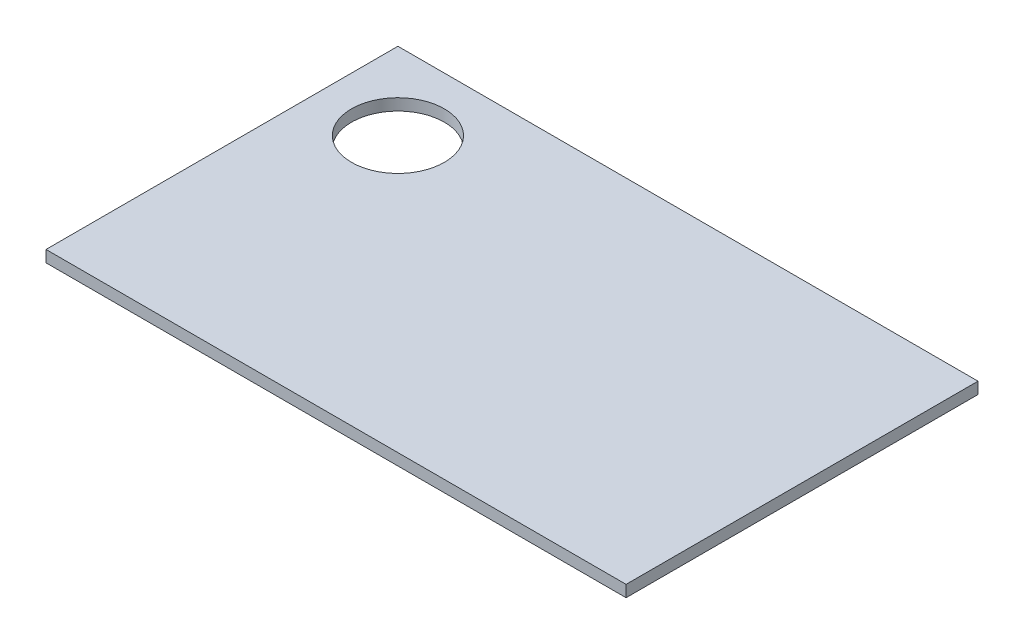
ISO-10303-21;
HEADER;
FILE_DESCRIPTION(('STEP AP214'),'2;1');
FILE_NAME('part.step','',(''),(''),'','','');
FILE_SCHEMA(('AUTOMOTIVE_DESIGN { 1 0 10303 214 1 1 1 1 }'));
ENDSEC;
DATA;
#1=APPLICATION_CONTEXT('core data for automotive mechanical design processes');
#2=APPLICATION_PROTOCOL_DEFINITION('international standard','automotive_design',2000,#1);
#3=PRODUCT_CONTEXT('',#1,'mechanical');
#4=PRODUCT('Part','Part','',(#3));
#5=PRODUCT_RELATED_PRODUCT_CATEGORY('part','',(#4));
#6=PRODUCT_DEFINITION_FORMATION('','',#4);
#7=PRODUCT_DEFINITION_CONTEXT('part definition',#1,'design');
#8=PRODUCT_DEFINITION('design','',#6,#7);
#9=PRODUCT_DEFINITION_SHAPE('','',#8);
#10=(LENGTH_UNIT() NAMED_UNIT(*) SI_UNIT(.MILLI.,.METRE.));
#11=(NAMED_UNIT(*) PLANE_ANGLE_UNIT() SI_UNIT($,.RADIAN.));
#12=(NAMED_UNIT(*) SI_UNIT($,.STERADIAN.) SOLID_ANGLE_UNIT());
#13=UNCERTAINTY_MEASURE_WITH_UNIT(LENGTH_MEASURE(1.E-05),#10,'distance_accuracy_value','');
#14=(GEOMETRIC_REPRESENTATION_CONTEXT(3) GLOBAL_UNCERTAINTY_ASSIGNED_CONTEXT((#13)) GLOBAL_UNIT_ASSIGNED_CONTEXT((#10,
#11,#12)) REPRESENTATION_CONTEXT('',''));
#15=CARTESIAN_POINT('',(0.,0.,0.));
#16=DIRECTION('',(0.,0.,1.));
#17=DIRECTION('',(1.,0.,0.));
#18=AXIS2_PLACEMENT_3D('',#15,#16,#17);
#19=CARTESIAN_POINT('',(-476.25,692.15,-298.45));
#20=DIRECTION('',(0.,0.,-1.));
#21=DIRECTION('',(-1.,0.,0.));
#22=AXIS2_PLACEMENT_3D('',#19,#20,#21);
#23=PLANE('',#22);
#24=DIRECTION('',(-1.,0.,0.));
#25=VECTOR('',#24,1.);
#26=CARTESIAN_POINT('',(-476.25,711.2,-298.45));
#27=LINE('',#26,#25);
#28=CARTESIAN_POINT('',(476.25,711.2,-298.45));
#29=VERTEX_POINT('',#28);
#30=CARTESIAN_POINT('',(-476.25,711.2,-298.45));
#31=VERTEX_POINT('',#30);
#32=EDGE_CURVE('E116',#29,#31,#27,.T.);
#33=ORIENTED_EDGE('',*,*,#32,.F.);
#34=DIRECTION('',(0.,1.,0.));
#35=VECTOR('',#34,1.);
#36=CARTESIAN_POINT('',(476.25,692.15,-298.45));
#37=LINE('',#36,#35);
#38=CARTESIAN_POINT('',(476.25,692.15,-298.45));
#39=VERTEX_POINT('',#38);
#40=EDGE_CURVE('E11',#39,#29,#37,.T.);
#41=ORIENTED_EDGE('',*,*,#40,.F.);
#42=DIRECTION('',(-1.,0.,0.));
#43=VECTOR('',#42,1.);
#44=CARTESIAN_POINT('',(-476.25,692.15,-298.45));
#45=LINE('',#44,#43);
#46=CARTESIAN_POINT('',(-476.25,692.15,-298.45));
#47=VERTEX_POINT('',#46);
#48=EDGE_CURVE('E106',#39,#47,#45,.T.);
#49=ORIENTED_EDGE('',*,*,#48,.T.);
#50=DIRECTION('',(0.,1.,0.));
#51=VECTOR('',#50,1.);
#52=CARTESIAN_POINT('',(-476.25,692.15,-298.45));
#53=LINE('',#52,#51);
#54=EDGE_CURVE('E47',#47,#31,#53,.T.);
#55=ORIENTED_EDGE('',*,*,#54,.T.);
#56=EDGE_LOOP('',(#33,#41,#49,#55));
#57=FACE_BOUND('',#56,.T.);
#58=ADVANCED_FACE('F44',(#57),#23,.T.);
#59=CARTESIAN_POINT('',(476.25,692.15,-298.45));
#60=DIRECTION('',(1.,0.,0.));
#61=DIRECTION('',(0.,0.,-1.));
#62=AXIS2_PLACEMENT_3D('',#59,#60,#61);
#63=PLANE('',#62);
#64=DIRECTION('',(0.,0.,-1.));
#65=VECTOR('',#64,1.);
#66=CARTESIAN_POINT('',(476.25,711.2,-298.45));
#67=LINE('',#66,#65);
#68=CARTESIAN_POINT('',(476.25,711.2,279.4));
#69=VERTEX_POINT('',#68);
#70=EDGE_CURVE('E110',#69,#29,#67,.T.);
#71=ORIENTED_EDGE('',*,*,#70,.F.);
#72=DIRECTION('',(0.,1.,0.));
#73=VECTOR('',#72,1.);
#74=CARTESIAN_POINT('',(476.25,692.15,279.4));
#75=LINE('',#74,#73);
#76=CARTESIAN_POINT('',(476.25,692.15,279.4));
#77=VERTEX_POINT('',#76);
#78=EDGE_CURVE('E54',#77,#69,#75,.T.);
#79=ORIENTED_EDGE('',*,*,#78,.F.);
#80=DIRECTION('',(0.,0.,-1.));
#81=VECTOR('',#80,1.);
#82=CARTESIAN_POINT('',(476.25,692.15,-298.45));
#83=LINE('',#82,#81);
#84=EDGE_CURVE('E101',#77,#39,#83,.T.);
#85=ORIENTED_EDGE('',*,*,#84,.T.);
#86=ORIENTED_EDGE('',*,*,#40,.T.);
#87=EDGE_LOOP('',(#71,#79,#85,#86));
#88=FACE_BOUND('',#87,.T.);
#89=ADVANCED_FACE('F139',(#88),#63,.T.);
#90=CARTESIAN_POINT('',(-476.25,692.15,279.4));
#91=DIRECTION('',(0.,0.,1.));
#92=DIRECTION('',(1.,0.,0.));
#93=AXIS2_PLACEMENT_3D('',#90,#91,#92);
#94=PLANE('',#93);
#95=DIRECTION('',(1.,0.,0.));
#96=VECTOR('',#95,1.);
#97=CARTESIAN_POINT('',(-476.25,711.2,279.4));
#98=LINE('',#97,#96);
#99=CARTESIAN_POINT('',(-476.25,711.2,279.4));
#100=VERTEX_POINT('',#99);
#101=EDGE_CURVE('E95',#100,#69,#98,.T.);
#102=ORIENTED_EDGE('',*,*,#101,.F.);
#103=DIRECTION('',(0.,1.,0.));
#104=VECTOR('',#103,1.);
#105=CARTESIAN_POINT('',(-476.25,692.15,279.4));
#106=LINE('',#105,#104);
#107=CARTESIAN_POINT('',(-476.25,692.15,279.4));
#108=VERTEX_POINT('',#107);
#109=EDGE_CURVE('E90',#108,#100,#106,.T.);
#110=ORIENTED_EDGE('',*,*,#109,.F.);
#111=DIRECTION('',(1.,0.,0.));
#112=VECTOR('',#111,1.);
#113=CARTESIAN_POINT('',(-476.25,692.15,279.4));
#114=LINE('',#113,#112);
#115=EDGE_CURVE('E93',#108,#77,#114,.T.);
#116=ORIENTED_EDGE('',*,*,#115,.T.);
#117=ORIENTED_EDGE('',*,*,#78,.T.);
#118=EDGE_LOOP('',(#102,#110,#116,#117));
#119=FACE_BOUND('',#118,.T.);
#120=ADVANCED_FACE('F92',(#119),#94,.T.);
#121=CARTESIAN_POINT('',(-476.25,692.15,-298.45));
#122=DIRECTION('',(-1.,0.,0.));
#123=DIRECTION('',(0.,0.,1.));
#124=AXIS2_PLACEMENT_3D('',#121,#122,#123);
#125=PLANE('',#124);
#126=DIRECTION('',(0.,0.,1.));
#127=VECTOR('',#126,1.);
#128=CARTESIAN_POINT('',(-476.25,711.2,-298.45));
#129=LINE('',#128,#127);
#130=EDGE_CURVE('E120',#31,#100,#129,.T.);
#131=ORIENTED_EDGE('',*,*,#130,.F.);
#132=ORIENTED_EDGE('',*,*,#54,.F.);
#133=DIRECTION('',(0.,0.,1.));
#134=VECTOR('',#133,1.);
#135=CARTESIAN_POINT('',(-476.25,692.15,-298.45));
#136=LINE('',#135,#134);
#137=EDGE_CURVE('E100',#47,#108,#136,.T.);
#138=ORIENTED_EDGE('',*,*,#137,.T.);
#139=ORIENTED_EDGE('',*,*,#109,.T.);
#140=EDGE_LOOP('',(#131,#132,#138,#139));
#141=FACE_BOUND('',#140,.T.);
#142=ADVANCED_FACE('F104',(#141),#125,.T.);
#143=CARTESIAN_POINT('',(0.,692.15,0.));
#144=DIRECTION('',(0.,-1.,0.));
#145=DIRECTION('',(0.,0.,-1.));
#146=AXIS2_PLACEMENT_3D('',#143,#144,#145);
#147=PLANE('',#146);
#148=CARTESIAN_POINT('',(-349.25,692.15,-171.45));
#149=DIRECTION('',(0.,1.,0.));
#150=DIRECTION('',(0.,0.,1.));
#151=AXIS2_PLACEMENT_3D('',#148,#149,#150);
#152=CIRCLE('',#151,76.2);
#153=CARTESIAN_POINT('',(-349.25,692.15,-95.2500000000001));
#154=VERTEX_POINT('',#153);
#155=EDGE_CURVE('E121',#154,#154,#152,.T.);
#156=ORIENTED_EDGE('',*,*,#155,.T.);
#157=EDGE_LOOP('',(#156));
#158=FACE_BOUND('',#157,.T.);
#159=ORIENTED_EDGE('',*,*,#48,.F.);
#160=ORIENTED_EDGE('',*,*,#84,.F.);
#161=ORIENTED_EDGE('',*,*,#115,.F.);
#162=ORIENTED_EDGE('',*,*,#137,.F.);
#163=EDGE_LOOP('',(#159,#160,#161,#162));
#164=FACE_BOUND('',#163,.T.);
#165=ADVANCED_FACE('F99',(#158,#164),#147,.T.);
#166=CARTESIAN_POINT('',(0.,711.2,0.));
#167=DIRECTION('',(0.,-1.,0.));
#168=DIRECTION('',(0.,0.,-1.));
#169=AXIS2_PLACEMENT_3D('',#166,#167,#168);
#170=PLANE('',#169);
#171=CARTESIAN_POINT('',(-349.25,711.2,-171.45));
#172=DIRECTION('',(0.,1.,0.));
#173=DIRECTION('',(0.,0.,1.));
#174=AXIS2_PLACEMENT_3D('',#171,#172,#173);
#175=CIRCLE('',#174,76.2);
#176=CARTESIAN_POINT('',(-349.25,711.2,-95.2500000000001));
#177=VERTEX_POINT('',#176);
#178=EDGE_CURVE('E169',#177,#177,#175,.T.);
#179=ORIENTED_EDGE('',*,*,#178,.F.);
#180=EDGE_LOOP('',(#179));
#181=FACE_BOUND('',#180,.T.);
#182=ORIENTED_EDGE('',*,*,#32,.T.);
#183=ORIENTED_EDGE('',*,*,#130,.T.);
#184=ORIENTED_EDGE('',*,*,#101,.T.);
#185=ORIENTED_EDGE('',*,*,#70,.T.);
#186=EDGE_LOOP('',(#182,#183,#184,#185));
#187=FACE_BOUND('',#186,.T.);
#188=ADVANCED_FACE('F138',(#181,#187),#170,.F.);
#189=CARTESIAN_POINT('',(-349.25,692.15,-171.45));
#190=DIRECTION('',(0.,1.,0.));
#191=DIRECTION('',(0.,0.,1.));
#192=AXIS2_PLACEMENT_3D('',#189,#190,#191);
#193=CYLINDRICAL_SURFACE('',#192,76.2);
#194=ORIENTED_EDGE('',*,*,#155,.F.);
#195=EDGE_LOOP('',(#194));
#196=FACE_BOUND('',#195,.T.);
#197=ORIENTED_EDGE('',*,*,#178,.T.);
#198=EDGE_LOOP('',(#197));
#199=FACE_BOUND('',#198,.T.);
#200=ADVANCED_FACE('F157',(#196,#199),#193,.F.);
#201=CLOSED_SHELL('',(#58,#89,#120,#142,#165,#188,#200));
#202=MANIFOLD_SOLID_BREP('B2',#201);
#203=ADVANCED_BREP_SHAPE_REPRESENTATION('',(#18,#202),#14);
#204=SHAPE_DEFINITION_REPRESENTATION(#9,#203);
ENDSEC;
END-ISO-10303-21;
